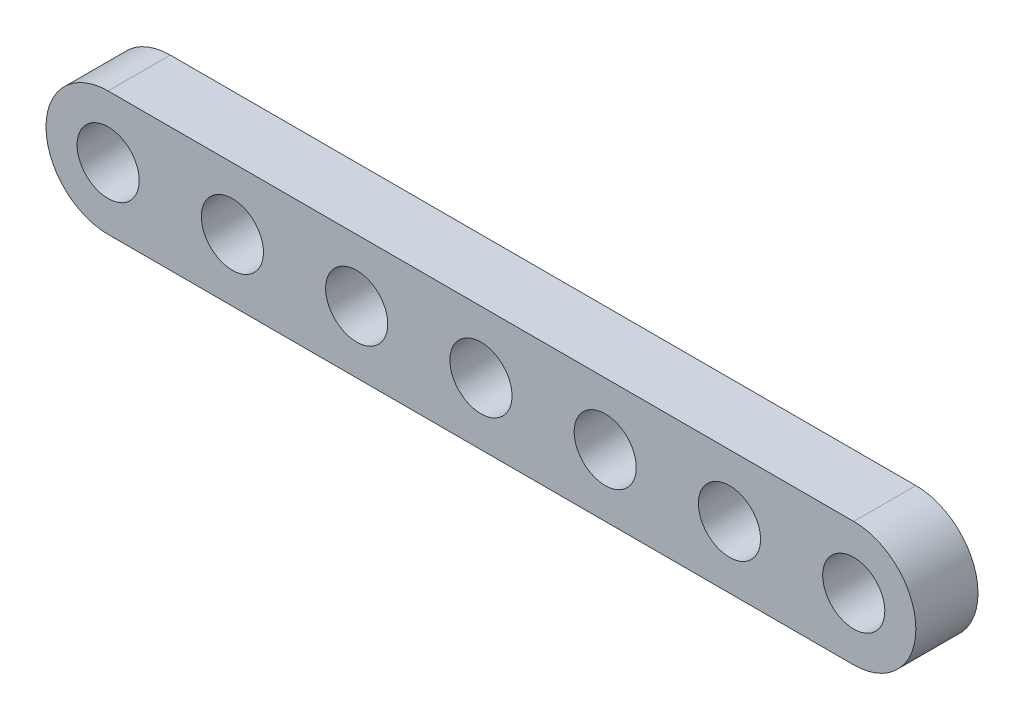
ISO-10303-21;
HEADER;
FILE_DESCRIPTION(('STEP AP214'),'2;1');
FILE_NAME('part.step','',(''),(''),'','','');
FILE_SCHEMA(('AUTOMOTIVE_DESIGN { 1 0 10303 214 1 1 1 1 }'));
ENDSEC;
DATA;
#1=APPLICATION_CONTEXT('core data for automotive mechanical design processes');
#2=APPLICATION_PROTOCOL_DEFINITION('international standard','automotive_design',2000,#1);
#3=PRODUCT_CONTEXT('',#1,'mechanical');
#4=PRODUCT('Part','Part','',(#3));
#5=PRODUCT_RELATED_PRODUCT_CATEGORY('part','',(#4));
#6=PRODUCT_DEFINITION_FORMATION('','',#4);
#7=PRODUCT_DEFINITION_CONTEXT('part definition',#1,'design');
#8=PRODUCT_DEFINITION('design','',#6,#7);
#9=PRODUCT_DEFINITION_SHAPE('','',#8);
#10=(LENGTH_UNIT() NAMED_UNIT(*) SI_UNIT(.MILLI.,.METRE.));
#11=(NAMED_UNIT(*) PLANE_ANGLE_UNIT() SI_UNIT($,.RADIAN.));
#12=(NAMED_UNIT(*) SI_UNIT($,.STERADIAN.) SOLID_ANGLE_UNIT());
#13=UNCERTAINTY_MEASURE_WITH_UNIT(LENGTH_MEASURE(1.E-05),#10,'distance_accuracy_value','');
#14=(GEOMETRIC_REPRESENTATION_CONTEXT(3) GLOBAL_UNCERTAINTY_ASSIGNED_CONTEXT((#13)) GLOBAL_UNIT_ASSIGNED_CONTEXT((#10,
#11,#12)) REPRESENTATION_CONTEXT('',''));
#15=CARTESIAN_POINT('',(0.,0.,0.));
#16=DIRECTION('',(0.,0.,1.));
#17=DIRECTION('',(1.,0.,0.));
#18=AXIS2_PLACEMENT_3D('',#15,#16,#17);
#19=CARTESIAN_POINT('',(-24.,0.,0.));
#20=DIRECTION('',(0.,0.,1.));
#21=DIRECTION('',(1.,0.,0.));
#22=AXIS2_PLACEMENT_3D('',#19,#20,#21);
#23=PLANE('',#22);
#24=CARTESIAN_POINT('',(-24.00000000001,0.,0.));
#25=DIRECTION('',(0.,0.,1.));
#26=DIRECTION('',(0.,-1.,0.));
#27=AXIS2_PLACEMENT_3D('',#24,#25,#26);
#28=CIRCLE('',#27,2.00000000001);
#29=CARTESIAN_POINT('',(-24.00000000001,-2.00000000001,0.));
#30=VERTEX_POINT('',#29);
#31=EDGE_CURVE('E159',#30,#30,#28,.T.);
#32=ORIENTED_EDGE('',*,*,#31,.T.);
#33=EDGE_LOOP('',(#32));
#34=FACE_BOUND('',#33,.T.);
#35=CARTESIAN_POINT('',(-16.00000000001,0.,0.));
#36=DIRECTION('',(0.,0.,1.));
#37=DIRECTION('',(0.,-1.,0.));
#38=AXIS2_PLACEMENT_3D('',#35,#36,#37);
#39=CIRCLE('',#38,2.00000000001);
#40=CARTESIAN_POINT('',(-16.00000000001,-2.00000000001,0.));
#41=VERTEX_POINT('',#40);
#42=EDGE_CURVE('E200',#41,#41,#39,.T.);
#43=ORIENTED_EDGE('',*,*,#42,.T.);
#44=EDGE_LOOP('',(#43));
#45=FACE_BOUND('',#44,.T.);
#46=CARTESIAN_POINT('',(-8.00000000001,0.,0.));
#47=DIRECTION('',(0.,0.,1.));
#48=DIRECTION('',(0.,-1.,0.));
#49=AXIS2_PLACEMENT_3D('',#46,#47,#48);
#50=CIRCLE('',#49,2.00000000001);
#51=CARTESIAN_POINT('',(-8.00000000001,-2.00000000001,0.));
#52=VERTEX_POINT('',#51);
#53=EDGE_CURVE('E225',#52,#52,#50,.T.);
#54=ORIENTED_EDGE('',*,*,#53,.T.);
#55=EDGE_LOOP('',(#54));
#56=FACE_BOUND('',#55,.T.);
#57=CARTESIAN_POINT('',(0.,0.,0.));
#58=DIRECTION('',(0.,0.,1.));
#59=DIRECTION('',(0.,-1.,0.));
#60=AXIS2_PLACEMENT_3D('',#57,#58,#59);
#61=CIRCLE('',#60,2.00000000001);
#62=CARTESIAN_POINT('',(0.,-2.00000000001,0.));
#63=VERTEX_POINT('',#62);
#64=EDGE_CURVE('E226',#63,#63,#61,.T.);
#65=ORIENTED_EDGE('',*,*,#64,.T.);
#66=EDGE_LOOP('',(#65));
#67=FACE_BOUND('',#66,.T.);
#68=CARTESIAN_POINT('',(8.00000000001,0.,0.));
#69=DIRECTION('',(0.,0.,1.));
#70=DIRECTION('',(0.,-1.,0.));
#71=AXIS2_PLACEMENT_3D('',#68,#69,#70);
#72=CIRCLE('',#71,2.00000000001);
#73=CARTESIAN_POINT('',(8.00000000001,-2.00000000001,0.));
#74=VERTEX_POINT('',#73);
#75=EDGE_CURVE('E237',#74,#74,#72,.T.);
#76=ORIENTED_EDGE('',*,*,#75,.T.);
#77=EDGE_LOOP('',(#76));
#78=FACE_BOUND('',#77,.T.);
#79=CARTESIAN_POINT('',(16.00000000001,0.,0.));
#80=DIRECTION('',(0.,0.,1.));
#81=DIRECTION('',(0.,-1.,0.));
#82=AXIS2_PLACEMENT_3D('',#79,#80,#81);
#83=CIRCLE('',#82,2.00000000001);
#84=CARTESIAN_POINT('',(16.00000000001,-2.00000000001,0.));
#85=VERTEX_POINT('',#84);
#86=EDGE_CURVE('E257',#85,#85,#83,.T.);
#87=ORIENTED_EDGE('',*,*,#86,.T.);
#88=EDGE_LOOP('',(#87));
#89=FACE_BOUND('',#88,.T.);
#90=CARTESIAN_POINT('',(24.00000000001,0.,0.));
#91=DIRECTION('',(0.,0.,1.));
#92=DIRECTION('',(0.,-1.,0.));
#93=AXIS2_PLACEMENT_3D('',#90,#91,#92);
#94=CIRCLE('',#93,2.00000000001);
#95=CARTESIAN_POINT('',(24.00000000001,-2.00000000001,0.));
#96=VERTEX_POINT('',#95);
#97=EDGE_CURVE('E269',#96,#96,#94,.T.);
#98=ORIENTED_EDGE('',*,*,#97,.T.);
#99=EDGE_LOOP('',(#98));
#100=FACE_BOUND('',#99,.T.);
#101=CARTESIAN_POINT('',(-24.00000000001,0.,0.));
#102=DIRECTION('',(0.,0.,1.));
#103=DIRECTION('',(0.,-1.,0.));
#104=AXIS2_PLACEMENT_3D('',#101,#102,#103);
#105=CIRCLE('',#104,4.00000000001);
#106=CARTESIAN_POINT('',(-24.,4.,0.));
#107=VERTEX_POINT('',#106);
#108=CARTESIAN_POINT('',(-24.,-4.,0.));
#109=VERTEX_POINT('',#108);
#110=EDGE_CURVE('E155',#107,#109,#105,.T.);
#111=ORIENTED_EDGE('',*,*,#110,.F.);
#112=DIRECTION('',(-1.,0.,0.));
#113=VECTOR('',#112,1.);
#114=CARTESIAN_POINT('',(-24.00000000001,4.00000000001,0.));
#115=LINE('',#114,#113);
#116=CARTESIAN_POINT('',(24.,4.,0.));
#117=VERTEX_POINT('',#116);
#118=EDGE_CURVE('E26',#117,#107,#115,.T.);
#119=ORIENTED_EDGE('',*,*,#118,.F.);
#120=CARTESIAN_POINT('',(24.00000000001,0.,0.));
#121=DIRECTION('',(0.,0.,1.));
#122=DIRECTION('',(0.,-1.,0.));
#123=AXIS2_PLACEMENT_3D('',#120,#121,#122);
#124=CIRCLE('',#123,4.00000000001);
#125=CARTESIAN_POINT('',(24.,-4.,0.));
#126=VERTEX_POINT('',#125);
#127=EDGE_CURVE('E130',#126,#117,#124,.T.);
#128=ORIENTED_EDGE('',*,*,#127,.F.);
#129=DIRECTION('',(1.,0.,0.));
#130=VECTOR('',#129,1.);
#131=CARTESIAN_POINT('',(-24.00000000001,-4.00000000001,0.));
#132=LINE('',#131,#130);
#133=EDGE_CURVE('E133',#109,#126,#132,.T.);
#134=ORIENTED_EDGE('',*,*,#133,.F.);
#135=EDGE_LOOP('',(#111,#119,#128,#134));
#136=FACE_BOUND('',#135,.T.);
#137=ADVANCED_FACE('F17',(#34,#45,#56,#67,#78,#89,#100,#136),#23,.F.);
#138=CARTESIAN_POINT('',(-24.,0.,4.));
#139=DIRECTION('',(0.,0.,1.));
#140=DIRECTION('',(1.,0.,0.));
#141=AXIS2_PLACEMENT_3D('',#138,#139,#140);
#142=PLANE('',#141);
#143=CARTESIAN_POINT('',(-24.00000000001,0.,4.00000000001));
#144=DIRECTION('',(0.,0.,1.));
#145=DIRECTION('',(0.,-1.,0.));
#146=AXIS2_PLACEMENT_3D('',#143,#144,#145);
#147=CIRCLE('',#146,2.00000000000999);
#148=CARTESIAN_POINT('',(-24.00000000001,-2.00000000000999,4.00000000001));
#149=VERTEX_POINT('',#148);
#150=EDGE_CURVE('E166',#149,#149,#147,.T.);
#151=ORIENTED_EDGE('',*,*,#150,.F.);
#152=EDGE_LOOP('',(#151));
#153=FACE_BOUND('',#152,.T.);
#154=CARTESIAN_POINT('',(-16.00000000001,0.,4.00000000001));
#155=DIRECTION('',(0.,0.,1.));
#156=DIRECTION('',(0.,-1.,0.));
#157=AXIS2_PLACEMENT_3D('',#154,#155,#156);
#158=CIRCLE('',#157,2.00000000000999);
#159=CARTESIAN_POINT('',(-16.00000000001,-2.00000000000999,4.00000000001));
#160=VERTEX_POINT('',#159);
#161=EDGE_CURVE('E214',#160,#160,#158,.T.);
#162=ORIENTED_EDGE('',*,*,#161,.F.);
#163=EDGE_LOOP('',(#162));
#164=FACE_BOUND('',#163,.T.);
#165=CARTESIAN_POINT('',(-8.00000000001,0.,4.00000000001));
#166=DIRECTION('',(0.,0.,1.));
#167=DIRECTION('',(0.,-1.,0.));
#168=AXIS2_PLACEMENT_3D('',#165,#166,#167);
#169=CIRCLE('',#168,2.00000000000999);
#170=CARTESIAN_POINT('',(-8.00000000001,-2.00000000000999,4.00000000001));
#171=VERTEX_POINT('',#170);
#172=EDGE_CURVE('E220',#171,#171,#169,.T.);
#173=ORIENTED_EDGE('',*,*,#172,.F.);
#174=EDGE_LOOP('',(#173));
#175=FACE_BOUND('',#174,.T.);
#176=CARTESIAN_POINT('',(0.,0.,4.00000000001));
#177=DIRECTION('',(0.,0.,1.));
#178=DIRECTION('',(0.,-1.,0.));
#179=AXIS2_PLACEMENT_3D('',#176,#177,#178);
#180=CIRCLE('',#179,2.00000000000999);
#181=CARTESIAN_POINT('',(0.,-2.00000000000999,4.00000000001));
#182=VERTEX_POINT('',#181);
#183=EDGE_CURVE('E233',#182,#182,#180,.T.);
#184=ORIENTED_EDGE('',*,*,#183,.F.);
#185=EDGE_LOOP('',(#184));
#186=FACE_BOUND('',#185,.T.);
#187=CARTESIAN_POINT('',(8.00000000001,0.,4.00000000001));
#188=DIRECTION('',(0.,0.,1.));
#189=DIRECTION('',(0.,-1.,0.));
#190=AXIS2_PLACEMENT_3D('',#187,#188,#189);
#191=CIRCLE('',#190,2.00000000000999);
#192=CARTESIAN_POINT('',(8.00000000001,-2.00000000000999,4.00000000001));
#193=VERTEX_POINT('',#192);
#194=EDGE_CURVE('E251',#193,#193,#191,.T.);
#195=ORIENTED_EDGE('',*,*,#194,.F.);
#196=EDGE_LOOP('',(#195));
#197=FACE_BOUND('',#196,.T.);
#198=CARTESIAN_POINT('',(16.00000000001,0.,4.00000000001));
#199=DIRECTION('',(0.,0.,1.));
#200=DIRECTION('',(0.,-1.,0.));
#201=AXIS2_PLACEMENT_3D('',#198,#199,#200);
#202=CIRCLE('',#201,2.00000000000999);
#203=CARTESIAN_POINT('',(16.00000000001,-2.00000000000999,4.00000000001));
#204=VERTEX_POINT('',#203);
#205=EDGE_CURVE('E261',#204,#204,#202,.T.);
#206=ORIENTED_EDGE('',*,*,#205,.F.);
#207=EDGE_LOOP('',(#206));
#208=FACE_BOUND('',#207,.T.);
#209=CARTESIAN_POINT('',(24.00000000001,0.,4.00000000001));
#210=DIRECTION('',(0.,0.,1.));
#211=DIRECTION('',(0.,-1.,0.));
#212=AXIS2_PLACEMENT_3D('',#209,#210,#211);
#213=CIRCLE('',#212,2.00000000000999);
#214=CARTESIAN_POINT('',(24.00000000001,-2.00000000000999,4.00000000001));
#215=VERTEX_POINT('',#214);
#216=EDGE_CURVE('E290',#215,#215,#213,.T.);
#217=ORIENTED_EDGE('',*,*,#216,.F.);
#218=EDGE_LOOP('',(#217));
#219=FACE_BOUND('',#218,.T.);
#220=CARTESIAN_POINT('',(-24.00000000001,0.,4.00000000001));
#221=DIRECTION('',(0.,0.,1.));
#222=DIRECTION('',(0.,-1.,0.));
#223=AXIS2_PLACEMENT_3D('',#220,#221,#222);
#224=CIRCLE('',#223,4.00000000001);
#225=CARTESIAN_POINT('',(-24.,4.,4.));
#226=VERTEX_POINT('',#225);
#227=CARTESIAN_POINT('',(-24.,-4.,4.));
#228=VERTEX_POINT('',#227);
#229=EDGE_CURVE('E125',#226,#228,#224,.T.);
#230=ORIENTED_EDGE('',*,*,#229,.T.);
#231=DIRECTION('',(1.,0.,0.));
#232=VECTOR('',#231,1.);
#233=CARTESIAN_POINT('',(-24.00000000001,-4.00000000001,4.00000000001));
#234=LINE('',#233,#232);
#235=CARTESIAN_POINT('',(24.,-4.,4.));
#236=VERTEX_POINT('',#235);
#237=EDGE_CURVE('E122',#228,#236,#234,.T.);
#238=ORIENTED_EDGE('',*,*,#237,.T.);
#239=CARTESIAN_POINT('',(24.00000000001,0.,4.00000000001));
#240=DIRECTION('',(0.,0.,1.));
#241=DIRECTION('',(0.,-1.,0.));
#242=AXIS2_PLACEMENT_3D('',#239,#240,#241);
#243=CIRCLE('',#242,4.00000000001);
#244=CARTESIAN_POINT('',(24.,4.,4.));
#245=VERTEX_POINT('',#244);
#246=EDGE_CURVE('E110',#236,#245,#243,.T.);
#247=ORIENTED_EDGE('',*,*,#246,.T.);
#248=DIRECTION('',(-1.,0.,0.));
#249=VECTOR('',#248,1.);
#250=CARTESIAN_POINT('',(-24.00000000001,4.00000000001,4.00000000001));
#251=LINE('',#250,#249);
#252=EDGE_CURVE('E11',#245,#226,#251,.T.);
#253=ORIENTED_EDGE('',*,*,#252,.T.);
#254=EDGE_LOOP('',(#230,#238,#247,#253));
#255=FACE_BOUND('',#254,.T.);
#256=ADVANCED_FACE('F123',(#153,#164,#175,#186,#197,#208,#219,#255),#142,.T.);
#257=CARTESIAN_POINT('',(-24.,4.,4.));
#258=DIRECTION('',(0.,-1.,0.));
#259=DIRECTION('',(0.,0.,-1.));
#260=AXIS2_PLACEMENT_3D('',#257,#258,#259);
#261=PLANE('',#260);
#262=ORIENTED_EDGE('',*,*,#118,.T.);
#263=DIRECTION('',(0.,0.,-1.));
#264=VECTOR('',#263,1.);
#265=CARTESIAN_POINT('',(-24.00000000001,4.00000000001,4.00000000001));
#266=LINE('',#265,#264);
#267=EDGE_CURVE('E140',#226,#107,#266,.T.);
#268=ORIENTED_EDGE('',*,*,#267,.F.);
#269=ORIENTED_EDGE('',*,*,#252,.F.);
#270=DIRECTION('',(0.,0.,-1.));
#271=VECTOR('',#270,1.);
#272=CARTESIAN_POINT('',(24.00000000001,4.00000000001,4.00000000001));
#273=LINE('',#272,#271);
#274=EDGE_CURVE('E117',#245,#117,#273,.T.);
#275=ORIENTED_EDGE('',*,*,#274,.T.);
#276=EDGE_LOOP('',(#262,#268,#269,#275));
#277=FACE_BOUND('',#276,.T.);
#278=ADVANCED_FACE('F149',(#277),#261,.F.);
#279=CARTESIAN_POINT('',(24.,0.,4.));
#280=DIRECTION('',(0.,0.,-1.));
#281=DIRECTION('',(0.,1.,0.));
#282=AXIS2_PLACEMENT_3D('',#279,#280,#281);
#283=CYLINDRICAL_SURFACE('',#282,4.);
#284=ORIENTED_EDGE('',*,*,#127,.T.);
#285=ORIENTED_EDGE('',*,*,#274,.F.);
#286=ORIENTED_EDGE('',*,*,#246,.F.);
#287=DIRECTION('',(0.,0.,-1.));
#288=VECTOR('',#287,1.);
#289=CARTESIAN_POINT('',(24.00000000001,-4.00000000001,4.00000000001));
#290=LINE('',#289,#288);
#291=EDGE_CURVE('E115',#236,#126,#290,.T.);
#292=ORIENTED_EDGE('',*,*,#291,.T.);
#293=EDGE_LOOP('',(#284,#285,#286,#292));
#294=FACE_BOUND('',#293,.T.);
#295=ADVANCED_FACE('F113',(#294),#283,.T.);
#296=CARTESIAN_POINT('',(-24.,-4.,4.));
#297=DIRECTION('',(0.,1.,0.));
#298=DIRECTION('',(1.,0.,0.));
#299=AXIS2_PLACEMENT_3D('',#296,#297,#298);
#300=PLANE('',#299);
#301=ORIENTED_EDGE('',*,*,#133,.T.);
#302=ORIENTED_EDGE('',*,*,#291,.F.);
#303=ORIENTED_EDGE('',*,*,#237,.F.);
#304=DIRECTION('',(0.,0.,-1.));
#305=VECTOR('',#304,1.);
#306=CARTESIAN_POINT('',(-24.00000000001,-4.00000000001,4.00000000001));
#307=LINE('',#306,#305);
#308=EDGE_CURVE('E158',#228,#109,#307,.T.);
#309=ORIENTED_EDGE('',*,*,#308,.T.);
#310=EDGE_LOOP('',(#301,#302,#303,#309));
#311=FACE_BOUND('',#310,.T.);
#312=ADVANCED_FACE('F132',(#311),#300,.F.);
#313=CARTESIAN_POINT('',(-24.,0.,4.));
#314=DIRECTION('',(0.,0.,-1.));
#315=DIRECTION('',(0.,1.,0.));
#316=AXIS2_PLACEMENT_3D('',#313,#314,#315);
#317=CYLINDRICAL_SURFACE('',#316,4.);
#318=ORIENTED_EDGE('',*,*,#110,.T.);
#319=ORIENTED_EDGE('',*,*,#308,.F.);
#320=ORIENTED_EDGE('',*,*,#229,.F.);
#321=ORIENTED_EDGE('',*,*,#267,.T.);
#322=EDGE_LOOP('',(#318,#319,#320,#321));
#323=FACE_BOUND('',#322,.T.);
#324=ADVANCED_FACE('F154',(#323),#317,.T.);
#325=CARTESIAN_POINT('',(-24.,0.,4.));
#326=DIRECTION('',(0.,0.,1.));
#327=DIRECTION('',(0.,-1.,0.));
#328=AXIS2_PLACEMENT_3D('',#325,#326,#327);
#329=CYLINDRICAL_SURFACE('',#328,2.);
#330=ORIENTED_EDGE('',*,*,#31,.F.);
#331=EDGE_LOOP('',(#330));
#332=FACE_BOUND('',#331,.T.);
#333=ORIENTED_EDGE('',*,*,#150,.T.);
#334=EDGE_LOOP('',(#333));
#335=FACE_BOUND('',#334,.T.);
#336=ADVANCED_FACE('F340',(#332,#335),#329,.F.);
#337=CARTESIAN_POINT('',(-16.,0.,4.));
#338=DIRECTION('',(0.,0.,1.));
#339=DIRECTION('',(0.,-1.,0.));
#340=AXIS2_PLACEMENT_3D('',#337,#338,#339);
#341=CYLINDRICAL_SURFACE('',#340,2.);
#342=ORIENTED_EDGE('',*,*,#42,.F.);
#343=EDGE_LOOP('',(#342));
#344=FACE_BOUND('',#343,.T.);
#345=ORIENTED_EDGE('',*,*,#161,.T.);
#346=EDGE_LOOP('',(#345));
#347=FACE_BOUND('',#346,.T.);
#348=ADVANCED_FACE('F337',(#344,#347),#341,.F.);
#349=CARTESIAN_POINT('',(-8.,0.,4.));
#350=DIRECTION('',(0.,0.,1.));
#351=DIRECTION('',(0.,-1.,0.));
#352=AXIS2_PLACEMENT_3D('',#349,#350,#351);
#353=CYLINDRICAL_SURFACE('',#352,2.);
#354=ORIENTED_EDGE('',*,*,#53,.F.);
#355=EDGE_LOOP('',(#354));
#356=FACE_BOUND('',#355,.T.);
#357=ORIENTED_EDGE('',*,*,#172,.T.);
#358=EDGE_LOOP('',(#357));
#359=FACE_BOUND('',#358,.T.);
#360=ADVANCED_FACE('F335',(#356,#359),#353,.F.);
#361=CARTESIAN_POINT('',(0.,0.,4.));
#362=DIRECTION('',(0.,0.,1.));
#363=DIRECTION('',(0.,-1.,0.));
#364=AXIS2_PLACEMENT_3D('',#361,#362,#363);
#365=CYLINDRICAL_SURFACE('',#364,2.);
#366=ORIENTED_EDGE('',*,*,#64,.F.);
#367=EDGE_LOOP('',(#366));
#368=FACE_BOUND('',#367,.T.);
#369=ORIENTED_EDGE('',*,*,#183,.T.);
#370=EDGE_LOOP('',(#369));
#371=FACE_BOUND('',#370,.T.);
#372=ADVANCED_FACE('F332',(#368,#371),#365,.F.);
#373=CARTESIAN_POINT('',(8.,0.,4.));
#374=DIRECTION('',(0.,0.,1.));
#375=DIRECTION('',(0.,-1.,0.));
#376=AXIS2_PLACEMENT_3D('',#373,#374,#375);
#377=CYLINDRICAL_SURFACE('',#376,2.);
#378=ORIENTED_EDGE('',*,*,#75,.F.);
#379=EDGE_LOOP('',(#378));
#380=FACE_BOUND('',#379,.T.);
#381=ORIENTED_EDGE('',*,*,#194,.T.);
#382=EDGE_LOOP('',(#381));
#383=FACE_BOUND('',#382,.T.);
#384=ADVANCED_FACE('F330',(#380,#383),#377,.F.);
#385=CARTESIAN_POINT('',(16.,0.,4.));
#386=DIRECTION('',(0.,0.,1.));
#387=DIRECTION('',(0.,-1.,0.));
#388=AXIS2_PLACEMENT_3D('',#385,#386,#387);
#389=CYLINDRICAL_SURFACE('',#388,2.);
#390=ORIENTED_EDGE('',*,*,#86,.F.);
#391=EDGE_LOOP('',(#390));
#392=FACE_BOUND('',#391,.T.);
#393=ORIENTED_EDGE('',*,*,#205,.T.);
#394=EDGE_LOOP('',(#393));
#395=FACE_BOUND('',#394,.T.);
#396=ADVANCED_FACE('F395',(#392,#395),#389,.F.);
#397=CARTESIAN_POINT('',(24.,0.,4.));
#398=DIRECTION('',(0.,0.,1.));
#399=DIRECTION('',(0.,-1.,0.));
#400=AXIS2_PLACEMENT_3D('',#397,#398,#399);
#401=CYLINDRICAL_SURFACE('',#400,2.);
#402=ORIENTED_EDGE('',*,*,#97,.F.);
#403=EDGE_LOOP('',(#402));
#404=FACE_BOUND('',#403,.T.);
#405=ORIENTED_EDGE('',*,*,#216,.T.);
#406=EDGE_LOOP('',(#405));
#407=FACE_BOUND('',#406,.T.);
#408=ADVANCED_FACE('F312',(#404,#407),#401,.F.);
#409=CLOSED_SHELL('',(#137,#256,#278,#295,#312,#324,#336,#348,#360,#372,#384,#396,#408));
#410=MANIFOLD_SOLID_BREP('B1',#409);
#411=ADVANCED_BREP_SHAPE_REPRESENTATION('',(#18,#410),#14);
#412=SHAPE_DEFINITION_REPRESENTATION(#9,#411);
ENDSEC;
END-ISO-10303-21;
